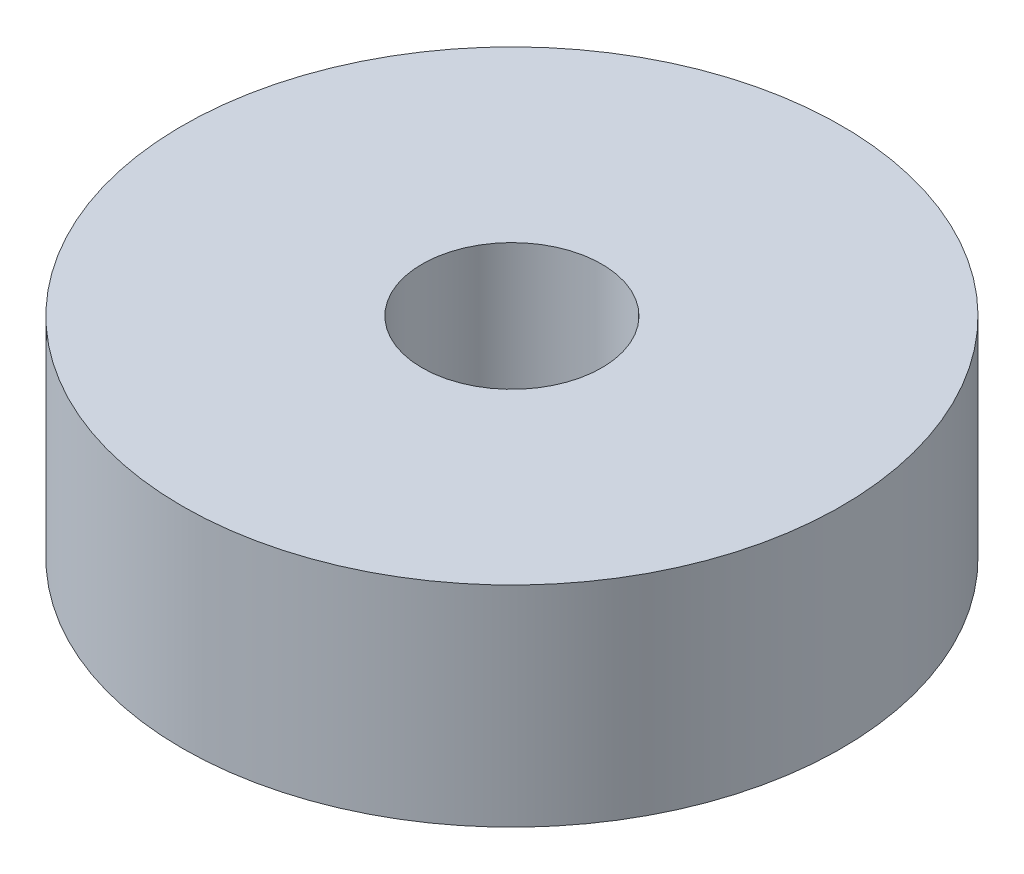
ISO-10303-21;
HEADER;
FILE_DESCRIPTION(('STEP AP214'),'2;1');
FILE_NAME('part.step','',(''),(''),'','','');
FILE_SCHEMA(('AUTOMOTIVE_DESIGN { 1 0 10303 214 1 1 1 1 }'));
ENDSEC;
DATA;
#1=APPLICATION_CONTEXT('core data for automotive mechanical design processes');
#2=APPLICATION_PROTOCOL_DEFINITION('international standard','automotive_design',2000,#1);
#3=PRODUCT_CONTEXT('',#1,'mechanical');
#4=PRODUCT('Part','Part','',(#3));
#5=PRODUCT_RELATED_PRODUCT_CATEGORY('part','',(#4));
#6=PRODUCT_DEFINITION_FORMATION('','',#4);
#7=PRODUCT_DEFINITION_CONTEXT('part definition',#1,'design');
#8=PRODUCT_DEFINITION('design','',#6,#7);
#9=PRODUCT_DEFINITION_SHAPE('','',#8);
#10=(LENGTH_UNIT() NAMED_UNIT(*) SI_UNIT(.MILLI.,.METRE.));
#11=(NAMED_UNIT(*) PLANE_ANGLE_UNIT() SI_UNIT($,.RADIAN.));
#12=(NAMED_UNIT(*) SI_UNIT($,.STERADIAN.) SOLID_ANGLE_UNIT());
#13=UNCERTAINTY_MEASURE_WITH_UNIT(LENGTH_MEASURE(1.E-05),#10,'distance_accuracy_value','');
#14=(GEOMETRIC_REPRESENTATION_CONTEXT(3) GLOBAL_UNCERTAINTY_ASSIGNED_CONTEXT((#13)) GLOBAL_UNIT_ASSIGNED_CONTEXT((#10,
#11,#12)) REPRESENTATION_CONTEXT('',''));
#15=CARTESIAN_POINT('',(0.,0.,0.));
#16=DIRECTION('',(0.,0.,1.));
#17=DIRECTION('',(1.,0.,0.));
#18=AXIS2_PLACEMENT_3D('',#15,#16,#17);
#19=CARTESIAN_POINT('',(0.,7.,0.));
#20=DIRECTION('',(0.,1.,0.));
#21=DIRECTION('',(0.,0.,1.));
#22=AXIS2_PLACEMENT_3D('',#19,#20,#21);
#23=PLANE('',#22);
#24=CARTESIAN_POINT('',(0.,7.,0.));
#25=DIRECTION('',(0.,1.,0.));
#26=DIRECTION('',(0.,0.,1.));
#27=AXIS2_PLACEMENT_3D('',#24,#25,#26);
#28=CIRCLE('',#27,11.);
#29=CARTESIAN_POINT('',(0.,7.,11.));
#30=VERTEX_POINT('',#29);
#31=EDGE_CURVE('E10',#30,#30,#28,.T.);
#32=ORIENTED_EDGE('',*,*,#31,.T.);
#33=EDGE_LOOP('',(#32));
#34=FACE_BOUND('',#33,.T.);
#35=CARTESIAN_POINT('',(0.,7.,0.));
#36=DIRECTION('',(0.,1.,0.));
#37=DIRECTION('',(0.,0.,1.));
#38=AXIS2_PLACEMENT_3D('',#35,#36,#37);
#39=CIRCLE('',#38,3.);
#40=CARTESIAN_POINT('',(0.,7.,3.));
#41=VERTEX_POINT('',#40);
#42=EDGE_CURVE('E52',#41,#41,#39,.T.);
#43=ORIENTED_EDGE('',*,*,#42,.F.);
#44=EDGE_LOOP('',(#43));
#45=FACE_BOUND('',#44,.T.);
#46=ADVANCED_FACE('F41',(#34,#45),#23,.T.);
#47=CARTESIAN_POINT('',(0.,0.,0.));
#48=DIRECTION('',(0.,1.,0.));
#49=DIRECTION('',(0.,0.,1.));
#50=AXIS2_PLACEMENT_3D('',#47,#48,#49);
#51=PLANE('',#50);
#52=CARTESIAN_POINT('',(0.,0.,0.));
#53=DIRECTION('',(0.,1.,0.));
#54=DIRECTION('',(0.,0.,1.));
#55=AXIS2_PLACEMENT_3D('',#52,#53,#54);
#56=CIRCLE('',#55,11.);
#57=CARTESIAN_POINT('',(0.,0.,11.));
#58=VERTEX_POINT('',#57);
#59=EDGE_CURVE('E45',#58,#58,#56,.T.);
#60=ORIENTED_EDGE('',*,*,#59,.F.);
#61=EDGE_LOOP('',(#60));
#62=FACE_BOUND('',#61,.T.);
#63=CARTESIAN_POINT('',(0.,0.,0.));
#64=DIRECTION('',(0.,1.,0.));
#65=DIRECTION('',(0.,0.,1.));
#66=AXIS2_PLACEMENT_3D('',#63,#64,#65);
#67=CIRCLE('',#66,3.);
#68=CARTESIAN_POINT('',(0.,0.,3.));
#69=VERTEX_POINT('',#68);
#70=EDGE_CURVE('E54',#69,#69,#67,.T.);
#71=ORIENTED_EDGE('',*,*,#70,.T.);
#72=EDGE_LOOP('',(#71));
#73=FACE_BOUND('',#72,.T.);
#74=ADVANCED_FACE('F64',(#62,#73),#51,.F.);
#75=CARTESIAN_POINT('',(0.,7.,0.));
#76=DIRECTION('',(0.,-1.,0.));
#77=DIRECTION('',(0.,0.,-1.));
#78=AXIS2_PLACEMENT_3D('',#75,#76,#77);
#79=CYLINDRICAL_SURFACE('',#78,11.);
#80=ORIENTED_EDGE('',*,*,#31,.F.);
#81=EDGE_LOOP('',(#80));
#82=FACE_BOUND('',#81,.T.);
#83=ORIENTED_EDGE('',*,*,#59,.T.);
#84=EDGE_LOOP('',(#83));
#85=FACE_BOUND('',#84,.T.);
#86=ADVANCED_FACE('F43',(#82,#85),#79,.T.);
#87=CARTESIAN_POINT('',(0.,7.,0.));
#88=DIRECTION('',(0.,-1.,0.));
#89=DIRECTION('',(0.,0.,-1.));
#90=AXIS2_PLACEMENT_3D('',#87,#88,#89);
#91=CYLINDRICAL_SURFACE('',#90,3.);
#92=ORIENTED_EDGE('',*,*,#42,.T.);
#93=EDGE_LOOP('',(#92));
#94=FACE_BOUND('',#93,.T.);
#95=ORIENTED_EDGE('',*,*,#70,.F.);
#96=EDGE_LOOP('',(#95));
#97=FACE_BOUND('',#96,.T.);
#98=ADVANCED_FACE('F60',(#94,#97),#91,.F.);
#99=CLOSED_SHELL('',(#46,#74,#86,#98));
#100=MANIFOLD_SOLID_BREP('B2',#99);
#101=ADVANCED_BREP_SHAPE_REPRESENTATION('',(#18,#100),#14);
#102=SHAPE_DEFINITION_REPRESENTATION(#9,#101);
ENDSEC;
END-ISO-10303-21;
